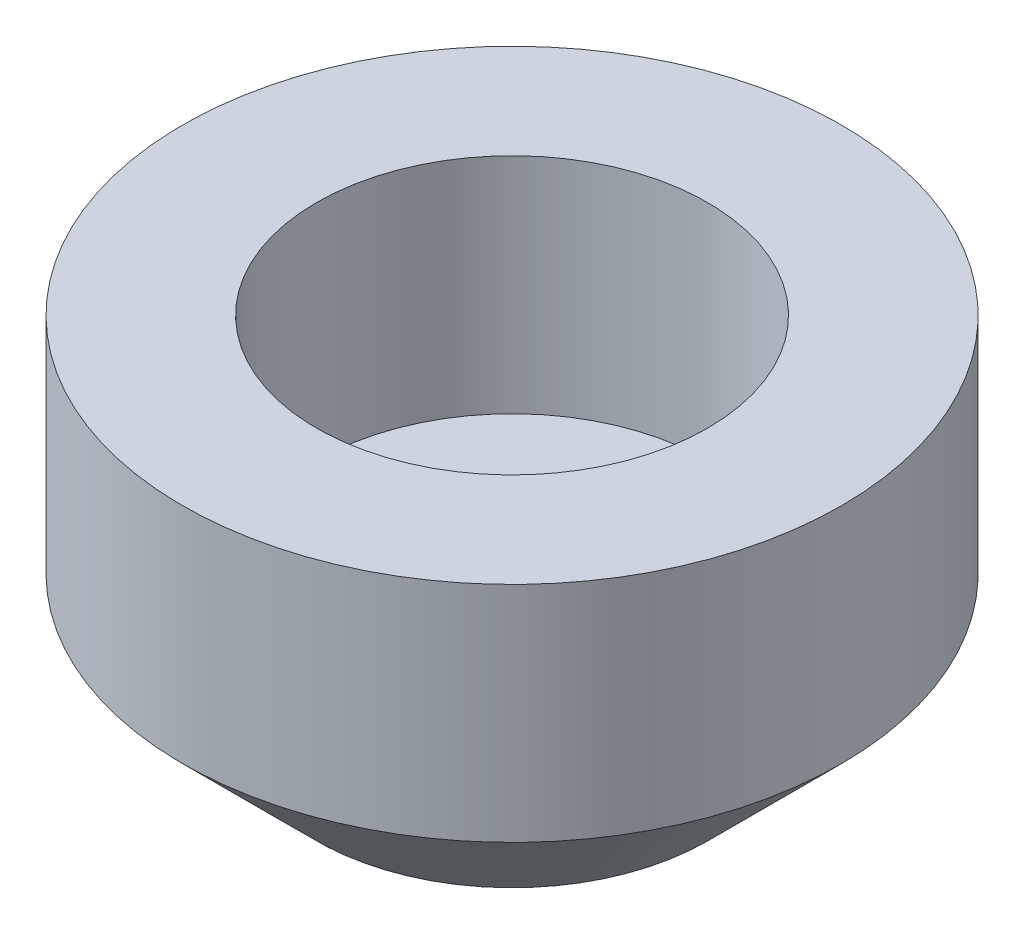
ISO-10303-21;
HEADER;
FILE_DESCRIPTION(('STEP AP214'),'2;1');
FILE_NAME('part.step','',(''),(''),'','','');
FILE_SCHEMA(('AUTOMOTIVE_DESIGN { 1 0 10303 214 1 1 1 1 }'));
ENDSEC;
DATA;
#1=APPLICATION_CONTEXT('core data for automotive mechanical design processes');
#2=APPLICATION_PROTOCOL_DEFINITION('international standard','automotive_design',2000,#1);
#3=PRODUCT_CONTEXT('',#1,'mechanical');
#4=PRODUCT('Part','Part','',(#3));
#5=PRODUCT_RELATED_PRODUCT_CATEGORY('part','',(#4));
#6=PRODUCT_DEFINITION_FORMATION('','',#4);
#7=PRODUCT_DEFINITION_CONTEXT('part definition',#1,'design');
#8=PRODUCT_DEFINITION('design','',#6,#7);
#9=PRODUCT_DEFINITION_SHAPE('','',#8);
#10=(LENGTH_UNIT() NAMED_UNIT(*) SI_UNIT(.MILLI.,.METRE.));
#11=(NAMED_UNIT(*) PLANE_ANGLE_UNIT() SI_UNIT($,.RADIAN.));
#12=(NAMED_UNIT(*) SI_UNIT($,.STERADIAN.) SOLID_ANGLE_UNIT());
#13=UNCERTAINTY_MEASURE_WITH_UNIT(LENGTH_MEASURE(1.E-05),#10,'distance_accuracy_value','');
#14=(GEOMETRIC_REPRESENTATION_CONTEXT(3) GLOBAL_UNCERTAINTY_ASSIGNED_CONTEXT((#13)) GLOBAL_UNIT_ASSIGNED_CONTEXT((#10,
#11,#12)) REPRESENTATION_CONTEXT('',''));
#15=CARTESIAN_POINT('',(0.,0.,0.));
#16=DIRECTION('',(0.,0.,1.));
#17=DIRECTION('',(1.,0.,0.));
#18=AXIS2_PLACEMENT_3D('',#15,#16,#17);
#19=CARTESIAN_POINT('',(0.,-3.,0.));
#20=DIRECTION('',(0.,-1.,0.));
#21=DIRECTION('',(1.,0.,0.));
#22=AXIS2_PLACEMENT_3D('',#19,#20,#21);
#23=CYLINDRICAL_SURFACE('',#22,4.375);
#24=CARTESIAN_POINT('',(0.,5.,0.));
#25=DIRECTION('',(0.,-1.,0.));
#26=DIRECTION('',(1.,0.,0.));
#27=AXIS2_PLACEMENT_3D('',#24,#25,#26);
#28=CIRCLE('',#27,4.375);
#29=CARTESIAN_POINT('',(4.375,5.,0.));
#30=VERTEX_POINT('',#29);
#31=EDGE_CURVE('E10',#30,#30,#28,.T.);
#32=ORIENTED_EDGE('',*,*,#31,.F.);
#33=EDGE_LOOP('',(#32));
#34=FACE_BOUND('',#33,.T.);
#35=CARTESIAN_POINT('',(0.,0.,0.));
#36=DIRECTION('',(0.,-1.,0.));
#37=DIRECTION('',(1.,0.,0.));
#38=AXIS2_PLACEMENT_3D('',#35,#36,#37);
#39=CIRCLE('',#38,4.375);
#40=CARTESIAN_POINT('',(4.375,0.,0.));
#41=VERTEX_POINT('',#40);
#42=EDGE_CURVE('E50',#41,#41,#39,.T.);
#43=ORIENTED_EDGE('',*,*,#42,.T.);
#44=EDGE_LOOP('',(#43));
#45=FACE_BOUND('',#44,.T.);
#46=ADVANCED_FACE('F31',(#34,#45),#23,.F.);
#47=CARTESIAN_POINT('',(-4.375,5.,0.));
#48=DIRECTION('',(0.,-1.,0.));
#49=DIRECTION('',(1.,0.,0.));
#50=AXIS2_PLACEMENT_3D('',#47,#48,#49);
#51=PLANE('',#50);
#52=CARTESIAN_POINT('',(0.,5.,0.));
#53=DIRECTION('',(0.,-1.,0.));
#54=DIRECTION('',(1.,0.,0.));
#55=AXIS2_PLACEMENT_3D('',#52,#53,#54);
#56=CIRCLE('',#55,7.375);
#57=CARTESIAN_POINT('',(7.375,5.,0.));
#58=VERTEX_POINT('',#57);
#59=EDGE_CURVE('E37',#58,#58,#56,.T.);
#60=ORIENTED_EDGE('',*,*,#59,.F.);
#61=EDGE_LOOP('',(#60));
#62=FACE_BOUND('',#61,.T.);
#63=ORIENTED_EDGE('',*,*,#31,.T.);
#64=EDGE_LOOP('',(#63));
#65=FACE_BOUND('',#64,.T.);
#66=ADVANCED_FACE('F66',(#62,#65),#51,.F.);
#67=CARTESIAN_POINT('',(0.,-3.,0.));
#68=DIRECTION('',(0.,-1.,0.));
#69=DIRECTION('',(1.,0.,0.));
#70=AXIS2_PLACEMENT_3D('',#67,#68,#69);
#71=CYLINDRICAL_SURFACE('',#70,7.375);
#72=CARTESIAN_POINT('',(0.,0.,0.));
#73=DIRECTION('',(0.,-1.,0.));
#74=DIRECTION('',(1.,0.,0.));
#75=AXIS2_PLACEMENT_3D('',#72,#73,#74);
#76=CIRCLE('',#75,7.375);
#77=CARTESIAN_POINT('',(7.375,0.,0.));
#78=VERTEX_POINT('',#77);
#79=EDGE_CURVE('E41',#78,#78,#76,.T.);
#80=ORIENTED_EDGE('',*,*,#79,.F.);
#81=EDGE_LOOP('',(#80));
#82=FACE_BOUND('',#81,.T.);
#83=ORIENTED_EDGE('',*,*,#59,.T.);
#84=EDGE_LOOP('',(#83));
#85=FACE_BOUND('',#84,.T.);
#86=ADVANCED_FACE('F71',(#82,#85),#71,.T.);
#87=CARTESIAN_POINT('',(0.,0.,0.));
#88=DIRECTION('',(0.,1.,0.));
#89=DIRECTION('',(-1.,0.,0.));
#90=AXIS2_PLACEMENT_3D('',#87,#88,#89);
#91=CONICAL_SURFACE('',#90,7.375,0.785398163397447);
#92=CARTESIAN_POINT('',(0.,-3.,0.));
#93=DIRECTION('',(0.,-1.,0.));
#94=DIRECTION('',(1.,0.,0.));
#95=AXIS2_PLACEMENT_3D('',#92,#93,#94);
#96=CIRCLE('',#95,4.375);
#97=CARTESIAN_POINT('',(4.375,-3.,0.));
#98=VERTEX_POINT('',#97);
#99=EDGE_CURVE('E45',#98,#98,#96,.T.);
#100=ORIENTED_EDGE('',*,*,#99,.F.);
#101=EDGE_LOOP('',(#100));
#102=FACE_BOUND('',#101,.T.);
#103=ORIENTED_EDGE('',*,*,#79,.T.);
#104=EDGE_LOOP('',(#103));
#105=FACE_BOUND('',#104,.T.);
#106=ADVANCED_FACE('F62',(#102,#105),#91,.T.);
#107=CARTESIAN_POINT('',(-4.375,-3.,0.));
#108=DIRECTION('',(0.,1.,0.));
#109=DIRECTION('',(-1.,0.,0.));
#110=AXIS2_PLACEMENT_3D('',#107,#108,#109);
#111=PLANE('',#110);
#112=ORIENTED_EDGE('',*,*,#99,.T.);
#113=EDGE_LOOP('',(#112));
#114=FACE_BOUND('',#113,.T.);
#115=ADVANCED_FACE('F57',(#114),#111,.F.);
#116=CARTESIAN_POINT('',(0.,0.,0.));
#117=DIRECTION('',(0.,-1.,0.));
#118=DIRECTION('',(1.,0.,0.));
#119=AXIS2_PLACEMENT_3D('',#116,#117,#118);
#120=PLANE('',#119);
#121=ORIENTED_EDGE('',*,*,#42,.F.);
#122=EDGE_LOOP('',(#121));
#123=FACE_BOUND('',#122,.T.);
#124=ADVANCED_FACE('F55',(#123),#120,.F.);
#125=CLOSED_SHELL('',(#46,#66,#86,#106,#115,#124));
#126=MANIFOLD_SOLID_BREP('B2',#125);
#127=ADVANCED_BREP_SHAPE_REPRESENTATION('',(#18,#126),#14);
#128=SHAPE_DEFINITION_REPRESENTATION(#9,#127);
ENDSEC;
END-ISO-10303-21;
